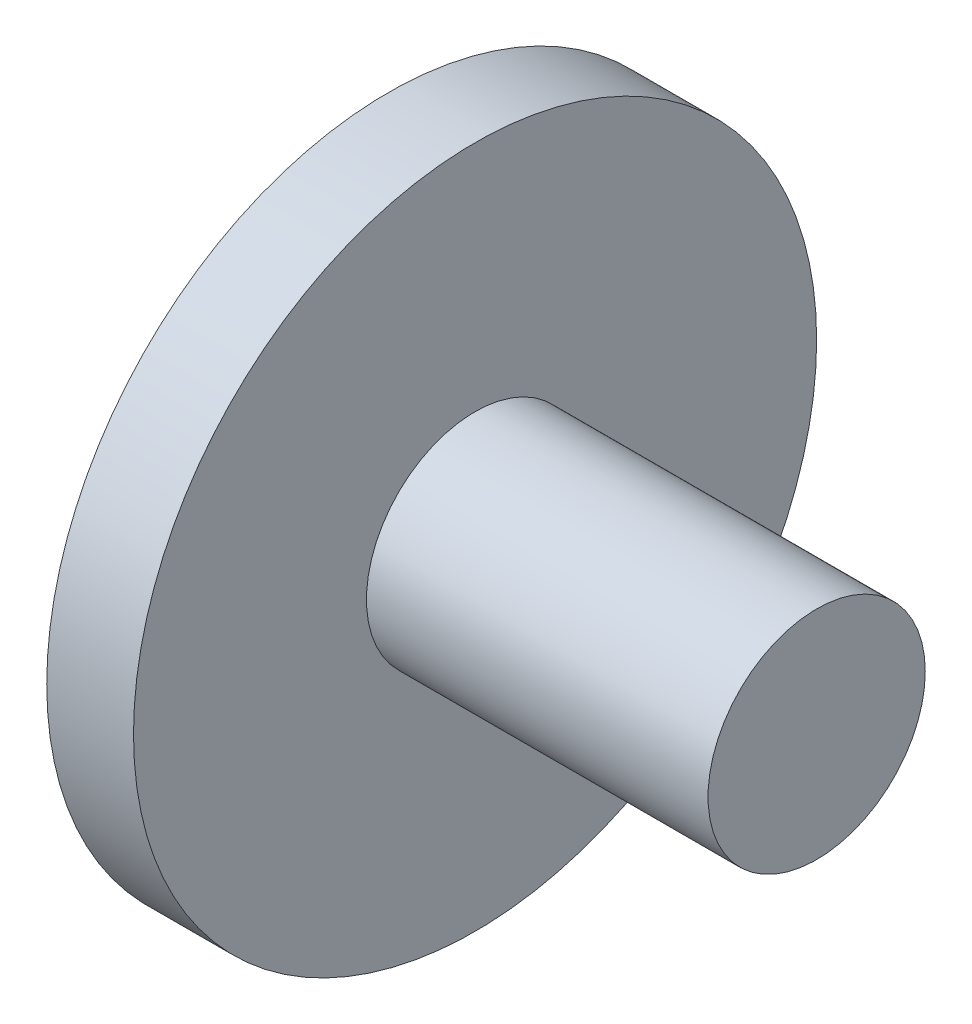
ISO-10303-21;
HEADER;
FILE_DESCRIPTION(('STEP AP214'),'2;1');
FILE_NAME('part.step','',(''),(''),'','','');
FILE_SCHEMA(('AUTOMOTIVE_DESIGN { 1 0 10303 214 1 1 1 1 }'));
ENDSEC;
DATA;
#1=APPLICATION_CONTEXT('core data for automotive mechanical design processes');
#2=APPLICATION_PROTOCOL_DEFINITION('international standard','automotive_design',2000,#1);
#3=PRODUCT_CONTEXT('',#1,'mechanical');
#4=PRODUCT('Part','Part','',(#3));
#5=PRODUCT_RELATED_PRODUCT_CATEGORY('part','',(#4));
#6=PRODUCT_DEFINITION_FORMATION('','',#4);
#7=PRODUCT_DEFINITION_CONTEXT('part definition',#1,'design');
#8=PRODUCT_DEFINITION('design','',#6,#7);
#9=PRODUCT_DEFINITION_SHAPE('','',#8);
#10=(LENGTH_UNIT() NAMED_UNIT(*) SI_UNIT(.MILLI.,.METRE.));
#11=(NAMED_UNIT(*) PLANE_ANGLE_UNIT() SI_UNIT($,.RADIAN.));
#12=(NAMED_UNIT(*) SI_UNIT($,.STERADIAN.) SOLID_ANGLE_UNIT());
#13=UNCERTAINTY_MEASURE_WITH_UNIT(LENGTH_MEASURE(1.E-05),#10,'distance_accuracy_value','');
#14=(GEOMETRIC_REPRESENTATION_CONTEXT(3) GLOBAL_UNCERTAINTY_ASSIGNED_CONTEXT((#13)) GLOBAL_UNIT_ASSIGNED_CONTEXT((#10,
#11,#12)) REPRESENTATION_CONTEXT('',''));
#15=CARTESIAN_POINT('',(0.,0.,0.));
#16=DIRECTION('',(0.,0.,1.));
#17=DIRECTION('',(1.,0.,0.));
#18=AXIS2_PLACEMENT_3D('',#15,#16,#17);
#19=CARTESIAN_POINT('',(-12.7,0.,0.));
#20=DIRECTION('',(1.,0.,0.));
#21=DIRECTION('',(0.,0.,-1.));
#22=AXIS2_PLACEMENT_3D('',#19,#20,#21);
#23=CYLINDRICAL_SURFACE('',#22,50.);
#24=CARTESIAN_POINT('',(-12.7,0.,0.));
#25=DIRECTION('',(1.,0.,0.));
#26=DIRECTION('',(0.,0.,-1.));
#27=AXIS2_PLACEMENT_3D('',#24,#25,#26);
#28=CIRCLE('',#27,50.);
#29=CARTESIAN_POINT('',(-12.7,0.,-50.));
#30=VERTEX_POINT('',#29);
#31=EDGE_CURVE('E51',#30,#30,#28,.T.);
#32=ORIENTED_EDGE('',*,*,#31,.T.);
#33=EDGE_LOOP('',(#32));
#34=FACE_BOUND('',#33,.T.);
#35=CARTESIAN_POINT('',(0.,0.,0.));
#36=DIRECTION('',(1.,0.,0.));
#37=DIRECTION('',(0.,0.,-1.));
#38=AXIS2_PLACEMENT_3D('',#35,#36,#37);
#39=CIRCLE('',#38,50.);
#40=CARTESIAN_POINT('',(0.,0.,-50.));
#41=VERTEX_POINT('',#40);
#42=EDGE_CURVE('E46',#41,#41,#39,.T.);
#43=ORIENTED_EDGE('',*,*,#42,.F.);
#44=EDGE_LOOP('',(#43));
#45=FACE_BOUND('',#44,.T.);
#46=ADVANCED_FACE('F43',(#34,#45),#23,.T.);
#47=CARTESIAN_POINT('',(-12.7,0.,0.));
#48=DIRECTION('',(1.,0.,0.));
#49=DIRECTION('',(0.,0.,-1.));
#50=AXIS2_PLACEMENT_3D('',#47,#48,#49);
#51=PLANE('',#50);
#52=ORIENTED_EDGE('',*,*,#31,.F.);
#53=EDGE_LOOP('',(#52));
#54=FACE_BOUND('',#53,.T.);
#55=ADVANCED_FACE('F70',(#54),#51,.F.);
#56=CARTESIAN_POINT('',(0.,0.,0.));
#57=DIRECTION('',(1.,0.,0.));
#58=DIRECTION('',(0.,0.,-1.));
#59=AXIS2_PLACEMENT_3D('',#56,#57,#58);
#60=PLANE('',#59);
#61=CARTESIAN_POINT('',(0.,0.,0.));
#62=DIRECTION('',(1.,0.,0.));
#63=DIRECTION('',(0.,0.,-1.));
#64=AXIS2_PLACEMENT_3D('',#61,#62,#63);
#65=CIRCLE('',#64,15.8988684784913);
#66=CARTESIAN_POINT('',(0.,0.,-15.8988684784913));
#67=VERTEX_POINT('',#66);
#68=EDGE_CURVE('E10',#67,#67,#65,.T.);
#69=ORIENTED_EDGE('',*,*,#68,.F.);
#70=EDGE_LOOP('',(#69));
#71=FACE_BOUND('',#70,.T.);
#72=ORIENTED_EDGE('',*,*,#42,.T.);
#73=EDGE_LOOP('',(#72));
#74=FACE_BOUND('',#73,.T.);
#75=ADVANCED_FACE('F67',(#71,#74),#60,.T.);
#76=CARTESIAN_POINT('',(50.,0.,0.));
#77=DIRECTION('',(-1.,0.,0.));
#78=DIRECTION('',(0.,0.,1.));
#79=AXIS2_PLACEMENT_3D('',#76,#77,#78);
#80=CYLINDRICAL_SURFACE('',#79,15.8988684784913);
#81=CARTESIAN_POINT('',(50.,0.,0.));
#82=DIRECTION('',(1.,0.,0.));
#83=DIRECTION('',(0.,0.,-1.));
#84=AXIS2_PLACEMENT_3D('',#81,#82,#83);
#85=CIRCLE('',#84,15.8988684784913);
#86=CARTESIAN_POINT('',(50.,0.,-15.8988684784913));
#87=VERTEX_POINT('',#86);
#88=EDGE_CURVE('E58',#87,#87,#85,.T.);
#89=ORIENTED_EDGE('',*,*,#88,.F.);
#90=EDGE_LOOP('',(#89));
#91=FACE_BOUND('',#90,.T.);
#92=ORIENTED_EDGE('',*,*,#68,.T.);
#93=EDGE_LOOP('',(#92));
#94=FACE_BOUND('',#93,.T.);
#95=ADVANCED_FACE('F81',(#91,#94),#80,.T.);
#96=CARTESIAN_POINT('',(50.,0.,0.));
#97=DIRECTION('',(1.,0.,0.));
#98=DIRECTION('',(0.,0.,-1.));
#99=AXIS2_PLACEMENT_3D('',#96,#97,#98);
#100=PLANE('',#99);
#101=ORIENTED_EDGE('',*,*,#88,.T.);
#102=EDGE_LOOP('',(#101));
#103=FACE_BOUND('',#102,.T.);
#104=ADVANCED_FACE('F86',(#103),#100,.T.);
#105=CLOSED_SHELL('',(#46,#55,#75,#95,#104));
#106=MANIFOLD_SOLID_BREP('B2',#105);
#107=ADVANCED_BREP_SHAPE_REPRESENTATION('',(#18,#106),#14);
#108=SHAPE_DEFINITION_REPRESENTATION(#9,#107);
ENDSEC;
END-ISO-10303-21;
